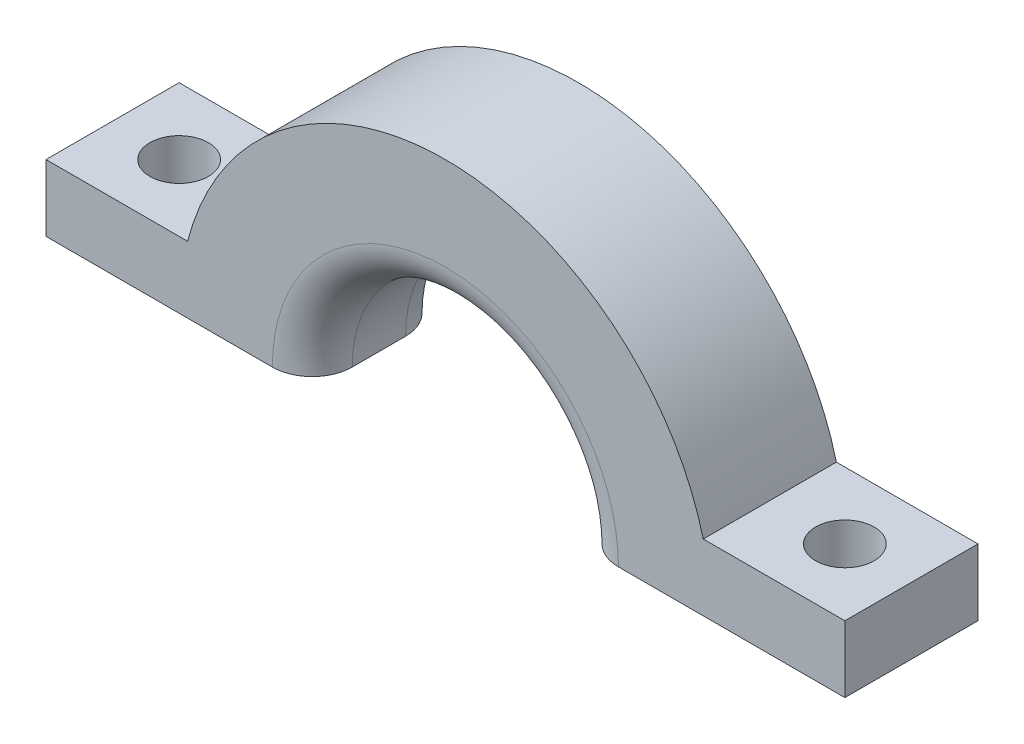
ISO-10303-21;
HEADER;
FILE_DESCRIPTION(('STEP AP214'),'2;1');
FILE_NAME('part.step','',(''),(''),'','','');
FILE_SCHEMA(('AUTOMOTIVE_DESIGN { 1 0 10303 214 1 1 1 1 }'));
ENDSEC;
DATA;
#1=APPLICATION_CONTEXT('core data for automotive mechanical design processes');
#2=APPLICATION_PROTOCOL_DEFINITION('international standard','automotive_design',2000,#1);
#3=PRODUCT_CONTEXT('',#1,'mechanical');
#4=PRODUCT('Part','Part','',(#3));
#5=PRODUCT_RELATED_PRODUCT_CATEGORY('part','',(#4));
#6=PRODUCT_DEFINITION_FORMATION('','',#4);
#7=PRODUCT_DEFINITION_CONTEXT('part definition',#1,'design');
#8=PRODUCT_DEFINITION('design','',#6,#7);
#9=PRODUCT_DEFINITION_SHAPE('','',#8);
#10=(LENGTH_UNIT() NAMED_UNIT(*) SI_UNIT(.MILLI.,.METRE.));
#11=(NAMED_UNIT(*) PLANE_ANGLE_UNIT() SI_UNIT($,.RADIAN.));
#12=(NAMED_UNIT(*) SI_UNIT($,.STERADIAN.) SOLID_ANGLE_UNIT());
#13=UNCERTAINTY_MEASURE_WITH_UNIT(LENGTH_MEASURE(1.E-05),#10,'distance_accuracy_value','');
#14=(GEOMETRIC_REPRESENTATION_CONTEXT(3) GLOBAL_UNCERTAINTY_ASSIGNED_CONTEXT((#13)) GLOBAL_UNIT_ASSIGNED_CONTEXT((#10,
#11,#12)) REPRESENTATION_CONTEXT('',''));
#15=CARTESIAN_POINT('',(0.,0.,0.));
#16=DIRECTION('',(0.,0.,1.));
#17=DIRECTION('',(1.,0.,0.));
#18=AXIS2_PLACEMENT_3D('',#15,#16,#17);
#19=CARTESIAN_POINT('',(0.,0.,0.));
#20=DIRECTION('',(0.,0.,1.));
#21=DIRECTION('',(1.,0.,0.));
#22=AXIS2_PLACEMENT_3D('',#19,#20,#21);
#23=CYLINDRICAL_SURFACE('',#22,20.);
#24=DIRECTION('',(0.,0.,1.));
#25=VECTOR('',#24,1.);
#26=CARTESIAN_POINT('',(19.3649167310371,5.,0.));
#27=LINE('',#26,#25);
#28=CARTESIAN_POINT('',(19.3649167310371,5.,-10.));
#29=VERTEX_POINT('',#28);
#30=CARTESIAN_POINT('',(19.3649167310371,5.,0.));
#31=VERTEX_POINT('',#30);
#32=EDGE_CURVE('E134',#29,#31,#27,.T.);
#33=ORIENTED_EDGE('',*,*,#32,.F.);
#34=CARTESIAN_POINT('',(0.,0.,-10.));
#35=DIRECTION('',(0.,0.,1.));
#36=DIRECTION('',(1.,0.,0.));
#37=AXIS2_PLACEMENT_3D('',#34,#35,#36);
#38=CIRCLE('',#37,20.);
#39=CARTESIAN_POINT('',(-19.3649167310371,5.,-10.));
#40=VERTEX_POINT('',#39);
#41=EDGE_CURVE('E11',#29,#40,#38,.T.);
#42=ORIENTED_EDGE('',*,*,#41,.T.);
#43=DIRECTION('',(0.,0.,1.));
#44=VECTOR('',#43,1.);
#45=CARTESIAN_POINT('',(-19.3649167310371,5.,0.));
#46=LINE('',#45,#44);
#47=CARTESIAN_POINT('',(-19.3649167310371,5.,0.));
#48=VERTEX_POINT('',#47);
#49=EDGE_CURVE('E157',#40,#48,#46,.T.);
#50=ORIENTED_EDGE('',*,*,#49,.T.);
#51=CARTESIAN_POINT('',(0.,0.,0.));
#52=DIRECTION('',(0.,0.,1.));
#53=DIRECTION('',(1.,0.,0.));
#54=AXIS2_PLACEMENT_3D('',#51,#52,#53);
#55=CIRCLE('',#54,20.);
#56=EDGE_CURVE('E53',#31,#48,#55,.T.);
#57=ORIENTED_EDGE('',*,*,#56,.F.);
#58=EDGE_LOOP('',(#33,#42,#50,#57));
#59=FACE_BOUND('',#58,.T.);
#60=ADVANCED_FACE('F32',(#59),#23,.T.);
#61=CARTESIAN_POINT('',(20.,-1.39659253553725E-13,-10.));
#62=DIRECTION('',(0.,0.,1.));
#63=DIRECTION('',(1.,0.,0.));
#64=AXIS2_PLACEMENT_3D('',#61,#62,#63);
#65=PLANE('',#64);
#66=DIRECTION('',(0.,-1.,0.));
#67=VECTOR('',#66,1.);
#68=CARTESIAN_POINT('',(30.,5.,-10.));
#69=LINE('',#68,#67);
#70=CARTESIAN_POINT('',(30.,5.,-10.));
#71=VERTEX_POINT('',#70);
#72=CARTESIAN_POINT('',(30.,0.,-10.));
#73=VERTEX_POINT('',#72);
#74=EDGE_CURVE('E111',#71,#73,#69,.T.);
#75=ORIENTED_EDGE('',*,*,#74,.T.);
#76=DIRECTION('',(1.,0.,0.));
#77=VECTOR('',#76,1.);
#78=CARTESIAN_POINT('',(20.,-1.39659253553725E-13,-10.));
#79=LINE('',#78,#77);
#80=CARTESIAN_POINT('',(13.,0.,-10.));
#81=VERTEX_POINT('',#80);
#82=EDGE_CURVE('E185',#81,#73,#79,.T.);
#83=ORIENTED_EDGE('',*,*,#82,.F.);
#84=CARTESIAN_POINT('',(0.,0.,-10.));
#85=DIRECTION('',(0.,0.,1.));
#86=DIRECTION('',(1.,0.,0.));
#87=AXIS2_PLACEMENT_3D('',#84,#85,#86);
#88=CIRCLE('',#87,13.);
#89=CARTESIAN_POINT('',(-13.,0.,-10.));
#90=VERTEX_POINT('',#89);
#91=EDGE_CURVE('E40',#81,#90,#88,.T.);
#92=ORIENTED_EDGE('',*,*,#91,.T.);
#93=DIRECTION('',(-1.,0.,0.));
#94=VECTOR('',#93,1.);
#95=CARTESIAN_POINT('',(-20.,0.,-10.));
#96=LINE('',#95,#94);
#97=CARTESIAN_POINT('',(-30.,0.,-10.));
#98=VERTEX_POINT('',#97);
#99=EDGE_CURVE('E172',#90,#98,#96,.T.);
#100=ORIENTED_EDGE('',*,*,#99,.T.);
#101=DIRECTION('',(0.,-1.,0.));
#102=VECTOR('',#101,1.);
#103=CARTESIAN_POINT('',(-30.,5.,-10.));
#104=LINE('',#103,#102);
#105=CARTESIAN_POINT('',(-30.,5.,-10.));
#106=VERTEX_POINT('',#105);
#107=EDGE_CURVE('E154',#106,#98,#104,.T.);
#108=ORIENTED_EDGE('',*,*,#107,.F.);
#109=DIRECTION('',(1.,0.,0.));
#110=VECTOR('',#109,1.);
#111=CARTESIAN_POINT('',(-20.,5.,-10.));
#112=LINE('',#111,#110);
#113=EDGE_CURVE('E149',#106,#40,#112,.T.);
#114=ORIENTED_EDGE('',*,*,#113,.T.);
#115=ORIENTED_EDGE('',*,*,#41,.F.);
#116=DIRECTION('',(1.,0.,0.));
#117=VECTOR('',#116,1.);
#118=CARTESIAN_POINT('',(20.,5.,-10.));
#119=LINE('',#118,#117);
#120=EDGE_CURVE('E108',#29,#71,#119,.T.);
#121=ORIENTED_EDGE('',*,*,#120,.T.);
#122=EDGE_LOOP('',(#75,#83,#92,#100,#108,#114,#115,#121));
#123=FACE_BOUND('',#122,.T.);
#124=ADVANCED_FACE('F34',(#123),#65,.F.);
#125=CARTESIAN_POINT('',(0.,0.,-7.));
#126=DIRECTION('',(0.,0.,1.));
#127=DIRECTION('',(1.,0.,0.));
#128=AXIS2_PLACEMENT_3D('',#125,#126,#127);
#129=TOROIDAL_SURFACE('',#128,13.,3.);
#130=CARTESIAN_POINT('',(0.,0.,-6.99999999999998));
#131=DIRECTION('',(0.,0.,1.));
#132=DIRECTION('',(1.,0.,0.));
#133=AXIS2_PLACEMENT_3D('',#130,#131,#132);
#134=CIRCLE('',#133,10.);
#135=CARTESIAN_POINT('',(10.,0.,-6.99999999999998));
#136=VERTEX_POINT('',#135);
#137=CARTESIAN_POINT('',(-10.,0.,-6.99999999999998));
#138=VERTEX_POINT('',#137);
#139=EDGE_CURVE('E193',#136,#138,#134,.T.);
#140=ORIENTED_EDGE('',*,*,#139,.T.);
#141=CARTESIAN_POINT('',(-13.,0.,-7.));
#142=DIRECTION('',(0.,1.,0.));
#143=DIRECTION('',(0.,0.,-1.));
#144=AXIS2_PLACEMENT_3D('',#141,#142,#143);
#145=CIRCLE('',#144,3.);
#146=EDGE_CURVE('E169',#138,#90,#145,.T.);
#147=ORIENTED_EDGE('',*,*,#146,.T.);
#148=ORIENTED_EDGE('',*,*,#91,.F.);
#149=CARTESIAN_POINT('',(13.,0.,-7.));
#150=DIRECTION('',(0.,-1.,0.));
#151=DIRECTION('',(0.,0.,-1.));
#152=AXIS2_PLACEMENT_3D('',#149,#150,#151);
#153=CIRCLE('',#152,3.);
#154=EDGE_CURVE('E182',#136,#81,#153,.T.);
#155=ORIENTED_EDGE('',*,*,#154,.F.);
#156=EDGE_LOOP('',(#140,#147,#148,#155));
#157=FACE_BOUND('',#156,.T.);
#158=ADVANCED_FACE('F198',(#157),#129,.T.);
#159=CARTESIAN_POINT('',(0.,0.,0.));
#160=DIRECTION('',(0.,0.,1.));
#161=DIRECTION('',(1.,0.,0.));
#162=AXIS2_PLACEMENT_3D('',#159,#160,#161);
#163=CYLINDRICAL_SURFACE('',#162,10.);
#164=CARTESIAN_POINT('',(0.,0.,-3.00000000000002));
#165=DIRECTION('',(0.,0.,1.));
#166=DIRECTION('',(1.,0.,0.));
#167=AXIS2_PLACEMENT_3D('',#164,#165,#166);
#168=CIRCLE('',#167,10.);
#169=CARTESIAN_POINT('',(10.,0.,-3.00000000000002));
#170=VERTEX_POINT('',#169);
#171=CARTESIAN_POINT('',(-10.,0.,-3.00000000000002));
#172=VERTEX_POINT('',#171);
#173=EDGE_CURVE('E191',#170,#172,#168,.T.);
#174=ORIENTED_EDGE('',*,*,#173,.T.);
#175=DIRECTION('',(0.,0.,-1.));
#176=VECTOR('',#175,1.);
#177=CARTESIAN_POINT('',(-10.,0.,-3.00000000000002));
#178=LINE('',#177,#176);
#179=EDGE_CURVE('E166',#172,#138,#178,.T.);
#180=ORIENTED_EDGE('',*,*,#179,.T.);
#181=ORIENTED_EDGE('',*,*,#139,.F.);
#182=DIRECTION('',(0.,0.,-1.));
#183=VECTOR('',#182,1.);
#184=CARTESIAN_POINT('',(10.,0.,-3.00000000000002));
#185=LINE('',#184,#183);
#186=EDGE_CURVE('E179',#170,#136,#185,.T.);
#187=ORIENTED_EDGE('',*,*,#186,.F.);
#188=EDGE_LOOP('',(#174,#180,#181,#187));
#189=FACE_BOUND('',#188,.T.);
#190=ADVANCED_FACE('F248',(#189),#163,.F.);
#191=CARTESIAN_POINT('',(0.,0.,-3.));
#192=DIRECTION('',(0.,0.,1.));
#193=DIRECTION('',(1.,0.,0.));
#194=AXIS2_PLACEMENT_3D('',#191,#192,#193);
#195=TOROIDAL_SURFACE('',#194,13.,3.);
#196=CARTESIAN_POINT('',(0.,0.,0.));
#197=DIRECTION('',(0.,0.,1.));
#198=DIRECTION('',(1.,0.,0.));
#199=AXIS2_PLACEMENT_3D('',#196,#197,#198);
#200=CIRCLE('',#199,13.);
#201=CARTESIAN_POINT('',(13.,0.,0.));
#202=VERTEX_POINT('',#201);
#203=CARTESIAN_POINT('',(-13.,0.,0.));
#204=VERTEX_POINT('',#203);
#205=EDGE_CURVE('E188',#202,#204,#200,.T.);
#206=ORIENTED_EDGE('',*,*,#205,.T.);
#207=CARTESIAN_POINT('',(-13.,0.,-3.));
#208=DIRECTION('',(0.,1.,0.));
#209=DIRECTION('',(0.,0.,1.));
#210=AXIS2_PLACEMENT_3D('',#207,#208,#209);
#211=CIRCLE('',#210,3.);
#212=EDGE_CURVE('E163',#204,#172,#211,.T.);
#213=ORIENTED_EDGE('',*,*,#212,.T.);
#214=ORIENTED_EDGE('',*,*,#173,.F.);
#215=CARTESIAN_POINT('',(13.,0.,-3.));
#216=DIRECTION('',(0.,-1.,0.));
#217=DIRECTION('',(0.,0.,1.));
#218=AXIS2_PLACEMENT_3D('',#215,#216,#217);
#219=CIRCLE('',#218,3.);
#220=EDGE_CURVE('E176',#202,#170,#219,.T.);
#221=ORIENTED_EDGE('',*,*,#220,.F.);
#222=EDGE_LOOP('',(#206,#213,#214,#221));
#223=FACE_BOUND('',#222,.T.);
#224=ADVANCED_FACE('F238',(#223),#195,.T.);
#225=CARTESIAN_POINT('',(20.,-1.39659253553725E-13,0.));
#226=DIRECTION('',(0.,0.,-1.));
#227=DIRECTION('',(-1.,0.,0.));
#228=AXIS2_PLACEMENT_3D('',#225,#226,#227);
#229=PLANE('',#228);
#230=ORIENTED_EDGE('',*,*,#205,.F.);
#231=DIRECTION('',(-1.,0.,0.));
#232=VECTOR('',#231,1.);
#233=CARTESIAN_POINT('',(20.,-1.39659253553725E-13,0.));
#234=LINE('',#233,#232);
#235=CARTESIAN_POINT('',(30.,0.,0.));
#236=VERTEX_POINT('',#235);
#237=EDGE_CURVE('E174',#236,#202,#234,.T.);
#238=ORIENTED_EDGE('',*,*,#237,.F.);
#239=DIRECTION('',(0.,-1.,0.));
#240=VECTOR('',#239,1.);
#241=CARTESIAN_POINT('',(30.,5.,0.));
#242=LINE('',#241,#240);
#243=CARTESIAN_POINT('',(30.,5.,0.));
#244=VERTEX_POINT('',#243);
#245=EDGE_CURVE('E125',#244,#236,#242,.T.);
#246=ORIENTED_EDGE('',*,*,#245,.F.);
#247=DIRECTION('',(-1.,0.,0.));
#248=VECTOR('',#247,1.);
#249=CARTESIAN_POINT('',(20.,5.,0.));
#250=LINE('',#249,#248);
#251=EDGE_CURVE('E117',#244,#31,#250,.T.);
#252=ORIENTED_EDGE('',*,*,#251,.T.);
#253=ORIENTED_EDGE('',*,*,#56,.T.);
#254=DIRECTION('',(-1.,0.,0.));
#255=VECTOR('',#254,1.);
#256=CARTESIAN_POINT('',(-20.,5.,0.));
#257=LINE('',#256,#255);
#258=CARTESIAN_POINT('',(-30.,5.,0.));
#259=VERTEX_POINT('',#258);
#260=EDGE_CURVE('E144',#48,#259,#257,.T.);
#261=ORIENTED_EDGE('',*,*,#260,.T.);
#262=DIRECTION('',(0.,-1.,0.));
#263=VECTOR('',#262,1.);
#264=CARTESIAN_POINT('',(-30.,5.,0.));
#265=LINE('',#264,#263);
#266=CARTESIAN_POINT('',(-30.,0.,0.));
#267=VERTEX_POINT('',#266);
#268=EDGE_CURVE('E151',#259,#267,#265,.T.);
#269=ORIENTED_EDGE('',*,*,#268,.T.);
#270=DIRECTION('',(1.,0.,0.));
#271=VECTOR('',#270,1.);
#272=CARTESIAN_POINT('',(-20.,0.,0.));
#273=LINE('',#272,#271);
#274=EDGE_CURVE('E161',#267,#204,#273,.T.);
#275=ORIENTED_EDGE('',*,*,#274,.T.);
#276=EDGE_LOOP('',(#230,#238,#246,#252,#253,#261,#269,#275));
#277=FACE_BOUND('',#276,.T.);
#278=ADVANCED_FACE('F214',(#277),#229,.F.);
#279=CARTESIAN_POINT('',(13.,0.,-7.));
#280=DIRECTION('',(0.,1.,0.));
#281=DIRECTION('',(0.,0.,-1.));
#282=AXIS2_PLACEMENT_3D('',#279,#280,#281);
#283=PLANE('',#282);
#284=ORIENTED_EDGE('',*,*,#82,.T.);
#285=DIRECTION('',(0.,0.,1.));
#286=VECTOR('',#285,1.);
#287=CARTESIAN_POINT('',(30.,0.,0.));
#288=LINE('',#287,#286);
#289=EDGE_CURVE('E124',#73,#236,#288,.T.);
#290=ORIENTED_EDGE('',*,*,#289,.T.);
#291=ORIENTED_EDGE('',*,*,#237,.T.);
#292=ORIENTED_EDGE('',*,*,#220,.T.);
#293=ORIENTED_EDGE('',*,*,#186,.T.);
#294=ORIENTED_EDGE('',*,*,#154,.T.);
#295=EDGE_LOOP('',(#284,#290,#291,#292,#293,#294));
#296=FACE_BOUND('',#295,.T.);
#297=CARTESIAN_POINT('',(25.,0.,-5.));
#298=DIRECTION('',(0.,-1.,0.));
#299=DIRECTION('',(0.,0.,-1.));
#300=AXIS2_PLACEMENT_3D('',#297,#298,#299);
#301=CIRCLE('',#300,2.2);
#302=CARTESIAN_POINT('',(25.,0.,-7.2));
#303=VERTEX_POINT('',#302);
#304=EDGE_CURVE('E216',#303,#303,#301,.T.);
#305=ORIENTED_EDGE('',*,*,#304,.F.);
#306=EDGE_LOOP('',(#305));
#307=FACE_BOUND('',#306,.T.);
#308=ADVANCED_FACE('F229',(#296,#307),#283,.F.);
#309=CARTESIAN_POINT('',(-13.,0.,-7.));
#310=DIRECTION('',(0.,-1.,0.));
#311=DIRECTION('',(0.,0.,-1.));
#312=AXIS2_PLACEMENT_3D('',#309,#310,#311);
#313=PLANE('',#312);
#314=ORIENTED_EDGE('',*,*,#212,.F.);
#315=ORIENTED_EDGE('',*,*,#274,.F.);
#316=DIRECTION('',(0.,0.,-1.));
#317=VECTOR('',#316,1.);
#318=CARTESIAN_POINT('',(-30.,0.,0.));
#319=LINE('',#318,#317);
#320=EDGE_CURVE('E141',#267,#98,#319,.T.);
#321=ORIENTED_EDGE('',*,*,#320,.T.);
#322=ORIENTED_EDGE('',*,*,#99,.F.);
#323=ORIENTED_EDGE('',*,*,#146,.F.);
#324=ORIENTED_EDGE('',*,*,#179,.F.);
#325=EDGE_LOOP('',(#314,#315,#321,#322,#323,#324));
#326=FACE_BOUND('',#325,.T.);
#327=CARTESIAN_POINT('',(-25.,0.,-5.));
#328=DIRECTION('',(0.,-1.,0.));
#329=DIRECTION('',(0.,0.,-1.));
#330=AXIS2_PLACEMENT_3D('',#327,#328,#329);
#331=CIRCLE('',#330,2.2);
#332=CARTESIAN_POINT('',(-25.,0.,-7.2));
#333=VERTEX_POINT('',#332);
#334=EDGE_CURVE('E137',#333,#333,#331,.T.);
#335=ORIENTED_EDGE('',*,*,#334,.F.);
#336=EDGE_LOOP('',(#335));
#337=FACE_BOUND('',#336,.T.);
#338=ADVANCED_FACE('F202',(#326,#337),#313,.T.);
#339=CARTESIAN_POINT('',(0.,5.,0.));
#340=DIRECTION('',(0.,1.,0.));
#341=DIRECTION('',(0.,0.,1.));
#342=AXIS2_PLACEMENT_3D('',#339,#340,#341);
#343=PLANE('',#342);
#344=CARTESIAN_POINT('',(-25.,5.,-5.));
#345=DIRECTION('',(0.,-1.,0.));
#346=DIRECTION('',(0.,0.,-1.));
#347=AXIS2_PLACEMENT_3D('',#344,#345,#346);
#348=CIRCLE('',#347,2.2);
#349=CARTESIAN_POINT('',(-25.,5.,-7.2));
#350=VERTEX_POINT('',#349);
#351=EDGE_CURVE('E138',#350,#350,#348,.T.);
#352=ORIENTED_EDGE('',*,*,#351,.T.);
#353=EDGE_LOOP('',(#352));
#354=FACE_BOUND('',#353,.T.);
#355=ORIENTED_EDGE('',*,*,#49,.F.);
#356=ORIENTED_EDGE('',*,*,#113,.F.);
#357=DIRECTION('',(0.,0.,-1.));
#358=VECTOR('',#357,1.);
#359=CARTESIAN_POINT('',(-30.,5.,0.));
#360=LINE('',#359,#358);
#361=EDGE_CURVE('E146',#259,#106,#360,.T.);
#362=ORIENTED_EDGE('',*,*,#361,.F.);
#363=ORIENTED_EDGE('',*,*,#260,.F.);
#364=EDGE_LOOP('',(#355,#356,#362,#363));
#365=FACE_BOUND('',#364,.T.);
#366=ADVANCED_FACE('F211',(#354,#365),#343,.T.);
#367=CARTESIAN_POINT('',(-30.,5.,0.));
#368=DIRECTION('',(-1.,0.,0.));
#369=DIRECTION('',(0.,0.,1.));
#370=AXIS2_PLACEMENT_3D('',#367,#368,#369);
#371=PLANE('',#370);
#372=ORIENTED_EDGE('',*,*,#320,.F.);
#373=ORIENTED_EDGE('',*,*,#268,.F.);
#374=ORIENTED_EDGE('',*,*,#361,.T.);
#375=ORIENTED_EDGE('',*,*,#107,.T.);
#376=EDGE_LOOP('',(#372,#373,#374,#375));
#377=FACE_BOUND('',#376,.T.);
#378=ADVANCED_FACE('F207',(#377),#371,.T.);
#379=CARTESIAN_POINT('',(-25.,5.,-5.));
#380=DIRECTION('',(0.,-1.,0.));
#381=DIRECTION('',(0.,0.,-1.));
#382=AXIS2_PLACEMENT_3D('',#379,#380,#381);
#383=CYLINDRICAL_SURFACE('',#382,2.2);
#384=ORIENTED_EDGE('',*,*,#351,.F.);
#385=EDGE_LOOP('',(#384));
#386=FACE_BOUND('',#385,.T.);
#387=ORIENTED_EDGE('',*,*,#334,.T.);
#388=EDGE_LOOP('',(#387));
#389=FACE_BOUND('',#388,.T.);
#390=ADVANCED_FACE('F302',(#386,#389),#383,.F.);
#391=CARTESIAN_POINT('',(0.,5.,0.));
#392=DIRECTION('',(0.,-1.,0.));
#393=DIRECTION('',(0.,0.,-1.));
#394=AXIS2_PLACEMENT_3D('',#391,#392,#393);
#395=PLANE('',#394);
#396=CARTESIAN_POINT('',(25.,5.,-5.));
#397=DIRECTION('',(0.,-1.,0.));
#398=DIRECTION('',(0.,0.,-1.));
#399=AXIS2_PLACEMENT_3D('',#396,#397,#398);
#400=CIRCLE('',#399,2.2);
#401=CARTESIAN_POINT('',(25.,5.,-7.2));
#402=VERTEX_POINT('',#401);
#403=EDGE_CURVE('E133',#402,#402,#400,.T.);
#404=ORIENTED_EDGE('',*,*,#403,.T.);
#405=EDGE_LOOP('',(#404));
#406=FACE_BOUND('',#405,.T.);
#407=ORIENTED_EDGE('',*,*,#120,.F.);
#408=ORIENTED_EDGE('',*,*,#32,.T.);
#409=ORIENTED_EDGE('',*,*,#251,.F.);
#410=DIRECTION('',(0.,0.,1.));
#411=VECTOR('',#410,1.);
#412=CARTESIAN_POINT('',(30.,5.,0.));
#413=LINE('',#412,#411);
#414=EDGE_CURVE('E116',#71,#244,#413,.T.);
#415=ORIENTED_EDGE('',*,*,#414,.F.);
#416=EDGE_LOOP('',(#407,#408,#409,#415));
#417=FACE_BOUND('',#416,.T.);
#418=ADVANCED_FACE('F127',(#406,#417),#395,.F.);
#419=CARTESIAN_POINT('',(30.,5.,0.));
#420=DIRECTION('',(1.,0.,0.));
#421=DIRECTION('',(0.,0.,-1.));
#422=AXIS2_PLACEMENT_3D('',#419,#420,#421);
#423=PLANE('',#422);
#424=ORIENTED_EDGE('',*,*,#289,.F.);
#425=ORIENTED_EDGE('',*,*,#74,.F.);
#426=ORIENTED_EDGE('',*,*,#414,.T.);
#427=ORIENTED_EDGE('',*,*,#245,.T.);
#428=EDGE_LOOP('',(#424,#425,#426,#427));
#429=FACE_BOUND('',#428,.T.);
#430=ADVANCED_FACE('F121',(#429),#423,.T.);
#431=CARTESIAN_POINT('',(25.,5.,-5.));
#432=DIRECTION('',(0.,-1.,0.));
#433=DIRECTION('',(0.,0.,-1.));
#434=AXIS2_PLACEMENT_3D('',#431,#432,#433);
#435=CYLINDRICAL_SURFACE('',#434,2.2);
#436=ORIENTED_EDGE('',*,*,#403,.F.);
#437=EDGE_LOOP('',(#436));
#438=FACE_BOUND('',#437,.T.);
#439=ORIENTED_EDGE('',*,*,#304,.T.);
#440=EDGE_LOOP('',(#439));
#441=FACE_BOUND('',#440,.T.);
#442=ADVANCED_FACE('F223',(#438,#441),#435,.F.);
#443=CLOSED_SHELL('',(#60,#124,#158,#190,#224,#278,#308,#338,#366,#378,#390,#418,#430,#442));
#444=MANIFOLD_SOLID_BREP('B2',#443);
#445=ADVANCED_BREP_SHAPE_REPRESENTATION('',(#18,#444),#14);
#446=SHAPE_DEFINITION_REPRESENTATION(#9,#445);
ENDSEC;
END-ISO-10303-21;
